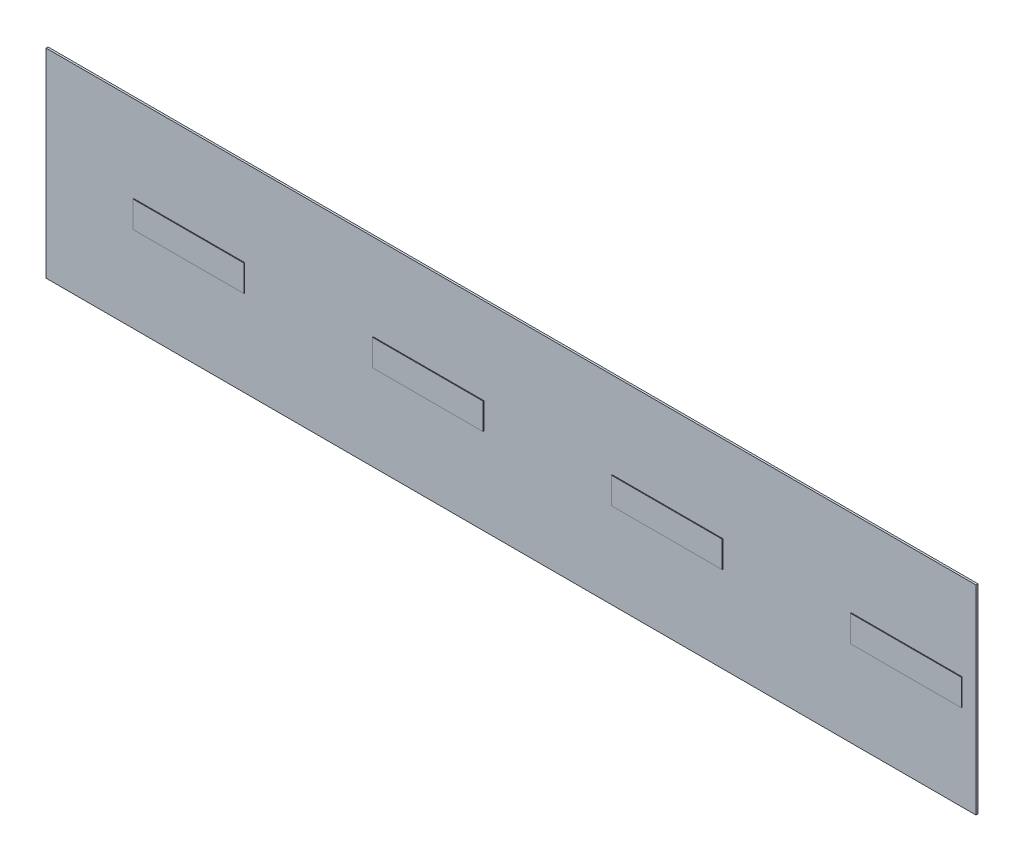
ISO-10303-21;
HEADER;
FILE_DESCRIPTION(('STEP AP214'),'2;1');
FILE_NAME('part.step','',(''),(''),'','','');
FILE_SCHEMA(('AUTOMOTIVE_DESIGN { 1 0 10303 214 1 1 1 1 }'));
ENDSEC;
DATA;
#1=APPLICATION_CONTEXT('core data for automotive mechanical design processes');
#2=APPLICATION_PROTOCOL_DEFINITION('international standard','automotive_design',2000,#1);
#3=PRODUCT_CONTEXT('',#1,'mechanical');
#4=PRODUCT('Part','Part','',(#3));
#5=PRODUCT_RELATED_PRODUCT_CATEGORY('part','',(#4));
#6=PRODUCT_DEFINITION_FORMATION('','',#4);
#7=PRODUCT_DEFINITION_CONTEXT('part definition',#1,'design');
#8=PRODUCT_DEFINITION('design','',#6,#7);
#9=PRODUCT_DEFINITION_SHAPE('','',#8);
#10=(LENGTH_UNIT() NAMED_UNIT(*) SI_UNIT(.MILLI.,.METRE.));
#11=(NAMED_UNIT(*) PLANE_ANGLE_UNIT() SI_UNIT($,.RADIAN.));
#12=(NAMED_UNIT(*) SI_UNIT($,.STERADIAN.) SOLID_ANGLE_UNIT());
#13=UNCERTAINTY_MEASURE_WITH_UNIT(LENGTH_MEASURE(1.E-05),#10,'distance_accuracy_value','');
#14=(GEOMETRIC_REPRESENTATION_CONTEXT(3) GLOBAL_UNCERTAINTY_ASSIGNED_CONTEXT((#13)) GLOBAL_UNIT_ASSIGNED_CONTEXT((#10,
#11,#12)) REPRESENTATION_CONTEXT('',''));
#15=CARTESIAN_POINT('',(0.,0.,0.));
#16=DIRECTION('',(0.,0.,1.));
#17=DIRECTION('',(1.,0.,0.));
#18=AXIS2_PLACEMENT_3D('',#15,#16,#17);
#19=CARTESIAN_POINT('',(0.,0.,1.5));
#20=DIRECTION('',(0.,0.,-1.));
#21=DIRECTION('',(-1.,0.,0.));
#22=AXIS2_PLACEMENT_3D('',#19,#20,#21);
#23=PLANE('',#22);
#24=DIRECTION('',(0.,1.,0.));
#25=VECTOR('',#24,1.);
#26=CARTESIAN_POINT('',(149.523395653635,65.0625036042411,1.5));
#27=LINE('',#26,#25);
#28=CARTESIAN_POINT('',(149.523395653635,65.0625036042411,1.5));
#29=VERTEX_POINT('',#28);
#30=CARTESIAN_POINT('',(149.523395653635,84.9374963957589,1.5));
#31=VERTEX_POINT('',#30);
#32=EDGE_CURVE('E227',#29,#31,#27,.T.);
#33=ORIENTED_EDGE('',*,*,#32,.F.);
#34=DIRECTION('',(1.,0.,0.));
#35=VECTOR('',#34,1.);
#36=CARTESIAN_POINT('',(66.1651402081605,65.0625036042411,1.5));
#37=LINE('',#36,#35);
#38=CARTESIAN_POINT('',(66.1651402081605,65.0625036042411,1.5));
#39=VERTEX_POINT('',#38);
#40=EDGE_CURVE('E217',#39,#29,#37,.T.);
#41=ORIENTED_EDGE('',*,*,#40,.F.);
#42=DIRECTION('',(0.,-1.,0.));
#43=VECTOR('',#42,1.);
#44=CARTESIAN_POINT('',(66.1651402081605,65.0625036042411,1.5));
#45=LINE('',#44,#43);
#46=CARTESIAN_POINT('',(66.1651402081605,84.9374963957589,1.5));
#47=VERTEX_POINT('',#46);
#48=EDGE_CURVE('E220',#47,#39,#45,.T.);
#49=ORIENTED_EDGE('',*,*,#48,.F.);
#50=DIRECTION('',(-1.,0.,0.));
#51=VECTOR('',#50,1.);
#52=CARTESIAN_POINT('',(66.1651402081605,84.9374963957589,1.5));
#53=LINE('',#52,#51);
#54=EDGE_CURVE('E224',#31,#47,#53,.T.);
#55=ORIENTED_EDGE('',*,*,#54,.F.);
#56=EDGE_LOOP('',(#33,#41,#49,#55));
#57=FACE_BOUND('',#56,.T.);
#58=DIRECTION('',(-1.,0.,0.));
#59=VECTOR('',#58,1.);
#60=CARTESIAN_POINT('',(246.16514020816,84.9374963957589,1.5));
#61=LINE('',#60,#59);
#62=CARTESIAN_POINT('',(329.523395653635,84.9374963957589,1.5));
#63=VERTEX_POINT('',#62);
#64=CARTESIAN_POINT('',(246.16514020816,84.9374963957589,1.5));
#65=VERTEX_POINT('',#64);
#66=EDGE_CURVE('E263',#63,#65,#61,.T.);
#67=ORIENTED_EDGE('',*,*,#66,.F.);
#68=DIRECTION('',(0.,1.,0.));
#69=VECTOR('',#68,1.);
#70=CARTESIAN_POINT('',(329.523395653635,65.0625036042411,1.5));
#71=LINE('',#70,#69);
#72=CARTESIAN_POINT('',(329.523395653635,65.0625036042411,1.5));
#73=VERTEX_POINT('',#72);
#74=EDGE_CURVE('E275',#73,#63,#71,.T.);
#75=ORIENTED_EDGE('',*,*,#74,.F.);
#76=DIRECTION('',(1.,0.,0.));
#77=VECTOR('',#76,1.);
#78=CARTESIAN_POINT('',(246.16514020816,65.0625036042411,1.5));
#79=LINE('',#78,#77);
#80=CARTESIAN_POINT('',(246.16514020816,65.0625036042411,1.5));
#81=VERTEX_POINT('',#80);
#82=EDGE_CURVE('E287',#81,#73,#79,.T.);
#83=ORIENTED_EDGE('',*,*,#82,.F.);
#84=DIRECTION('',(0.,-1.,0.));
#85=VECTOR('',#84,1.);
#86=CARTESIAN_POINT('',(246.16514020816,65.0625036042411,1.5));
#87=LINE('',#86,#85);
#88=EDGE_CURVE('E284',#65,#81,#87,.T.);
#89=ORIENTED_EDGE('',*,*,#88,.F.);
#90=EDGE_LOOP('',(#67,#75,#83,#89));
#91=FACE_BOUND('',#90,.T.);
#92=DIRECTION('',(0.,-1.,0.));
#93=VECTOR('',#92,1.);
#94=CARTESIAN_POINT('',(0.,0.,1.5));
#95=LINE('',#94,#93);
#96=CARTESIAN_POINT('',(0.,150.,1.5));
#97=VERTEX_POINT('',#96);
#98=CARTESIAN_POINT('',(0.,0.,1.5));
#99=VERTEX_POINT('',#98);
#100=EDGE_CURVE('E304',#97,#99,#95,.T.);
#101=ORIENTED_EDGE('',*,*,#100,.T.);
#102=DIRECTION('',(1.,0.,0.));
#103=VECTOR('',#102,1.);
#104=CARTESIAN_POINT('',(0.,0.,1.5));
#105=LINE('',#104,#103);
#106=CARTESIAN_POINT('',(700.,0.,1.5));
#107=VERTEX_POINT('',#106);
#108=EDGE_CURVE('E307',#99,#107,#105,.T.);
#109=ORIENTED_EDGE('',*,*,#108,.T.);
#110=DIRECTION('',(0.,1.,0.));
#111=VECTOR('',#110,1.);
#112=CARTESIAN_POINT('',(700.,0.,1.5));
#113=LINE('',#112,#111);
#114=CARTESIAN_POINT('',(700.,150.,1.5));
#115=VERTEX_POINT('',#114);
#116=EDGE_CURVE('E310',#107,#115,#113,.T.);
#117=ORIENTED_EDGE('',*,*,#116,.T.);
#118=DIRECTION('',(-1.,0.,0.));
#119=VECTOR('',#118,1.);
#120=CARTESIAN_POINT('',(0.,150.,1.5));
#121=LINE('',#120,#119);
#122=EDGE_CURVE('E312',#115,#97,#121,.T.);
#123=ORIENTED_EDGE('',*,*,#122,.T.);
#124=EDGE_LOOP('',(#101,#109,#117,#123));
#125=FACE_BOUND('',#124,.T.);
#126=DIRECTION('',(-1.,0.,0.));
#127=VECTOR('',#126,1.);
#128=CARTESIAN_POINT('',(426.16514020816,84.9374963957589,1.5));
#129=LINE('',#128,#127);
#130=CARTESIAN_POINT('',(509.523395653635,84.9374963957589,1.5));
#131=VERTEX_POINT('',#130);
#132=CARTESIAN_POINT('',(426.16514020816,84.9374963957589,1.5));
#133=VERTEX_POINT('',#132);
#134=EDGE_CURVE('E260',#131,#133,#129,.T.);
#135=ORIENTED_EDGE('',*,*,#134,.F.);
#136=DIRECTION('',(0.,1.,0.));
#137=VECTOR('',#136,1.);
#138=CARTESIAN_POINT('',(509.523395653635,65.0625036042411,1.5));
#139=LINE('',#138,#137);
#140=CARTESIAN_POINT('',(509.523395653635,65.0625036042411,1.5));
#141=VERTEX_POINT('',#140);
#142=EDGE_CURVE('E250',#141,#131,#139,.T.);
#143=ORIENTED_EDGE('',*,*,#142,.F.);
#144=DIRECTION('',(1.,0.,0.));
#145=VECTOR('',#144,1.);
#146=CARTESIAN_POINT('',(426.16514020816,65.0625036042411,1.5));
#147=LINE('',#146,#145);
#148=CARTESIAN_POINT('',(426.16514020816,65.0625036042411,1.5));
#149=VERTEX_POINT('',#148);
#150=EDGE_CURVE('E253',#149,#141,#147,.T.);
#151=ORIENTED_EDGE('',*,*,#150,.F.);
#152=DIRECTION('',(0.,-1.,0.));
#153=VECTOR('',#152,1.);
#154=CARTESIAN_POINT('',(426.16514020816,65.0625036042411,1.5));
#155=LINE('',#154,#153);
#156=EDGE_CURVE('E257',#133,#149,#155,.T.);
#157=ORIENTED_EDGE('',*,*,#156,.F.);
#158=EDGE_LOOP('',(#135,#143,#151,#157));
#159=FACE_BOUND('',#158,.T.);
#160=DIRECTION('',(-1.,0.,0.));
#161=VECTOR('',#160,1.);
#162=CARTESIAN_POINT('',(606.16514020816,84.9374963957589,1.5));
#163=LINE('',#162,#161);
#164=CARTESIAN_POINT('',(689.523395653635,84.9374963957589,1.5));
#165=VERTEX_POINT('',#164);
#166=CARTESIAN_POINT('',(606.16514020816,84.9374963957589,1.5));
#167=VERTEX_POINT('',#166);
#168=EDGE_CURVE('E170',#165,#167,#163,.T.);
#169=ORIENTED_EDGE('',*,*,#168,.F.);
#170=DIRECTION('',(0.,1.,0.));
#171=VECTOR('',#170,1.);
#172=CARTESIAN_POINT('',(689.523395653635,65.0625036042411,1.5));
#173=LINE('',#172,#171);
#174=CARTESIAN_POINT('',(689.523395653635,65.0625036042411,1.5));
#175=VERTEX_POINT('',#174);
#176=EDGE_CURVE('E172',#175,#165,#173,.T.);
#177=ORIENTED_EDGE('',*,*,#176,.F.);
#178=DIRECTION('',(1.,0.,0.));
#179=VECTOR('',#178,1.);
#180=CARTESIAN_POINT('',(606.16514020816,65.0625036042411,1.5));
#181=LINE('',#180,#179);
#182=CARTESIAN_POINT('',(606.16514020816,65.0625036042411,1.5));
#183=VERTEX_POINT('',#182);
#184=EDGE_CURVE('E57',#183,#175,#181,.T.);
#185=ORIENTED_EDGE('',*,*,#184,.F.);
#186=DIRECTION('',(0.,-1.,0.));
#187=VECTOR('',#186,1.);
#188=CARTESIAN_POINT('',(606.16514020816,65.0625036042411,1.5));
#189=LINE('',#188,#187);
#190=EDGE_CURVE('E52',#167,#183,#189,.T.);
#191=ORIENTED_EDGE('',*,*,#190,.F.);
#192=EDGE_LOOP('',(#169,#177,#185,#191));
#193=FACE_BOUND('',#192,.T.);
#194=ADVANCED_FACE('F37',(#57,#91,#125,#159,#193),#23,.F.);
#195=CARTESIAN_POINT('',(0.,0.,1.5));
#196=DIRECTION('',(1.,0.,0.));
#197=DIRECTION('',(0.,0.,-1.));
#198=AXIS2_PLACEMENT_3D('',#195,#196,#197);
#199=PLANE('',#198);
#200=DIRECTION('',(0.,-1.,0.));
#201=VECTOR('',#200,1.);
#202=CARTESIAN_POINT('',(0.,0.,0.));
#203=LINE('',#202,#201);
#204=CARTESIAN_POINT('',(0.,150.,0.));
#205=VERTEX_POINT('',#204);
#206=CARTESIAN_POINT('',(0.,0.,0.));
#207=VERTEX_POINT('',#206);
#208=EDGE_CURVE('E303',#205,#207,#203,.T.);
#209=ORIENTED_EDGE('',*,*,#208,.T.);
#210=DIRECTION('',(0.,0.,-1.));
#211=VECTOR('',#210,1.);
#212=CARTESIAN_POINT('',(0.,0.,1.5));
#213=LINE('',#212,#211);
#214=EDGE_CURVE('E11',#99,#207,#213,.T.);
#215=ORIENTED_EDGE('',*,*,#214,.F.);
#216=ORIENTED_EDGE('',*,*,#100,.F.);
#217=DIRECTION('',(0.,0.,-1.));
#218=VECTOR('',#217,1.);
#219=CARTESIAN_POINT('',(0.,150.,1.5));
#220=LINE('',#219,#218);
#221=EDGE_CURVE('E314',#97,#205,#220,.T.);
#222=ORIENTED_EDGE('',*,*,#221,.T.);
#223=EDGE_LOOP('',(#209,#215,#216,#222));
#224=FACE_BOUND('',#223,.T.);
#225=ADVANCED_FACE('F39',(#224),#199,.F.);
#226=CARTESIAN_POINT('',(0.,0.,1.5));
#227=DIRECTION('',(0.,1.,0.));
#228=DIRECTION('',(0.,0.,1.));
#229=AXIS2_PLACEMENT_3D('',#226,#227,#228);
#230=PLANE('',#229);
#231=DIRECTION('',(1.,0.,0.));
#232=VECTOR('',#231,1.);
#233=CARTESIAN_POINT('',(0.,0.,0.));
#234=LINE('',#233,#232);
#235=CARTESIAN_POINT('',(700.,0.,0.));
#236=VERTEX_POINT('',#235);
#237=EDGE_CURVE('E317',#207,#236,#234,.T.);
#238=ORIENTED_EDGE('',*,*,#237,.T.);
#239=DIRECTION('',(0.,0.,-1.));
#240=VECTOR('',#239,1.);
#241=CARTESIAN_POINT('',(700.,0.,1.5));
#242=LINE('',#241,#240);
#243=EDGE_CURVE('E45',#107,#236,#242,.T.);
#244=ORIENTED_EDGE('',*,*,#243,.F.);
#245=ORIENTED_EDGE('',*,*,#108,.F.);
#246=ORIENTED_EDGE('',*,*,#214,.T.);
#247=EDGE_LOOP('',(#238,#244,#245,#246));
#248=FACE_BOUND('',#247,.T.);
#249=ADVANCED_FACE('F347',(#248),#230,.F.);
#250=CARTESIAN_POINT('',(700.,0.,1.5));
#251=DIRECTION('',(-1.,0.,0.));
#252=DIRECTION('',(0.,0.,1.));
#253=AXIS2_PLACEMENT_3D('',#250,#251,#252);
#254=PLANE('',#253);
#255=DIRECTION('',(0.,1.,0.));
#256=VECTOR('',#255,1.);
#257=CARTESIAN_POINT('',(700.,0.,0.));
#258=LINE('',#257,#256);
#259=CARTESIAN_POINT('',(700.,150.,0.));
#260=VERTEX_POINT('',#259);
#261=EDGE_CURVE('E319',#236,#260,#258,.T.);
#262=ORIENTED_EDGE('',*,*,#261,.T.);
#263=DIRECTION('',(0.,0.,-1.));
#264=VECTOR('',#263,1.);
#265=CARTESIAN_POINT('',(700.,150.,1.5));
#266=LINE('',#265,#264);
#267=EDGE_CURVE('E324',#115,#260,#266,.T.);
#268=ORIENTED_EDGE('',*,*,#267,.F.);
#269=ORIENTED_EDGE('',*,*,#116,.F.);
#270=ORIENTED_EDGE('',*,*,#243,.T.);
#271=EDGE_LOOP('',(#262,#268,#269,#270));
#272=FACE_BOUND('',#271,.T.);
#273=ADVANCED_FACE('F331',(#272),#254,.F.);
#274=CARTESIAN_POINT('',(0.,150.,1.5));
#275=DIRECTION('',(0.,-1.,0.));
#276=DIRECTION('',(0.,0.,-1.));
#277=AXIS2_PLACEMENT_3D('',#274,#275,#276);
#278=PLANE('',#277);
#279=DIRECTION('',(-1.,0.,0.));
#280=VECTOR('',#279,1.);
#281=CARTESIAN_POINT('',(0.,150.,0.));
#282=LINE('',#281,#280);
#283=EDGE_CURVE('E308',#260,#205,#282,.T.);
#284=ORIENTED_EDGE('',*,*,#283,.T.);
#285=ORIENTED_EDGE('',*,*,#221,.F.);
#286=ORIENTED_EDGE('',*,*,#122,.F.);
#287=ORIENTED_EDGE('',*,*,#267,.T.);
#288=EDGE_LOOP('',(#284,#285,#286,#287));
#289=FACE_BOUND('',#288,.T.);
#290=ADVANCED_FACE('F340',(#289),#278,.F.);
#291=CARTESIAN_POINT('',(0.,0.,0.));
#292=DIRECTION('',(0.,0.,-1.));
#293=DIRECTION('',(-1.,0.,0.));
#294=AXIS2_PLACEMENT_3D('',#291,#292,#293);
#295=PLANE('',#294);
#296=ORIENTED_EDGE('',*,*,#208,.F.);
#297=ORIENTED_EDGE('',*,*,#283,.F.);
#298=ORIENTED_EDGE('',*,*,#261,.F.);
#299=ORIENTED_EDGE('',*,*,#237,.F.);
#300=EDGE_LOOP('',(#296,#297,#298,#299));
#301=FACE_BOUND('',#300,.T.);
#302=ADVANCED_FACE('F337',(#301),#295,.T.);
#303=CARTESIAN_POINT('',(246.16514020816,84.9374963957589,2.1));
#304=DIRECTION('',(0.,-1.,0.));
#305=DIRECTION('',(0.,0.,-1.));
#306=AXIS2_PLACEMENT_3D('',#303,#304,#305);
#307=PLANE('',#306);
#308=ORIENTED_EDGE('',*,*,#66,.T.);
#309=DIRECTION('',(0.,0.,-1.));
#310=VECTOR('',#309,1.);
#311=CARTESIAN_POINT('',(246.16514020816,84.9374963957589,2.1));
#312=LINE('',#311,#310);
#313=CARTESIAN_POINT('',(246.16514020816,84.9374963957589,2.1));
#314=VERTEX_POINT('',#313);
#315=EDGE_CURVE('E300',#314,#65,#312,.T.);
#316=ORIENTED_EDGE('',*,*,#315,.F.);
#317=DIRECTION('',(-1.,0.,0.));
#318=VECTOR('',#317,1.);
#319=CARTESIAN_POINT('',(246.16514020816,84.9374963957589,2.1));
#320=LINE('',#319,#318);
#321=CARTESIAN_POINT('',(329.523395653635,84.9374963957589,2.1));
#322=VERTEX_POINT('',#321);
#323=EDGE_CURVE('E271',#322,#314,#320,.T.);
#324=ORIENTED_EDGE('',*,*,#323,.F.);
#325=DIRECTION('',(0.,0.,-1.));
#326=VECTOR('',#325,1.);
#327=CARTESIAN_POINT('',(329.523395653635,84.9374963957589,2.1));
#328=LINE('',#327,#326);
#329=EDGE_CURVE('E281',#322,#63,#328,.T.);
#330=ORIENTED_EDGE('',*,*,#329,.T.);
#331=EDGE_LOOP('',(#308,#316,#324,#330));
#332=FACE_BOUND('',#331,.T.);
#333=ADVANCED_FACE('F362',(#332),#307,.F.);
#334=CARTESIAN_POINT('',(246.16514020816,65.0625036042411,2.1));
#335=DIRECTION('',(1.,0.,0.));
#336=DIRECTION('',(0.,0.,-1.));
#337=AXIS2_PLACEMENT_3D('',#334,#335,#336);
#338=PLANE('',#337);
#339=ORIENTED_EDGE('',*,*,#88,.T.);
#340=DIRECTION('',(0.,0.,-1.));
#341=VECTOR('',#340,1.);
#342=CARTESIAN_POINT('',(246.16514020816,65.0625036042411,2.1));
#343=LINE('',#342,#341);
#344=CARTESIAN_POINT('',(246.16514020816,65.0625036042411,2.1));
#345=VERTEX_POINT('',#344);
#346=EDGE_CURVE('E297',#345,#81,#343,.T.);
#347=ORIENTED_EDGE('',*,*,#346,.F.);
#348=DIRECTION('',(0.,-1.,0.));
#349=VECTOR('',#348,1.);
#350=CARTESIAN_POINT('',(246.16514020816,65.0625036042411,2.1));
#351=LINE('',#350,#349);
#352=EDGE_CURVE('E274',#314,#345,#351,.T.);
#353=ORIENTED_EDGE('',*,*,#352,.F.);
#354=ORIENTED_EDGE('',*,*,#315,.T.);
#355=EDGE_LOOP('',(#339,#347,#353,#354));
#356=FACE_BOUND('',#355,.T.);
#357=ADVANCED_FACE('F381',(#356),#338,.F.);
#358=CARTESIAN_POINT('',(246.16514020816,65.0625036042411,2.1));
#359=DIRECTION('',(0.,1.,0.));
#360=DIRECTION('',(0.,0.,1.));
#361=AXIS2_PLACEMENT_3D('',#358,#359,#360);
#362=PLANE('',#361);
#363=ORIENTED_EDGE('',*,*,#82,.T.);
#364=DIRECTION('',(0.,0.,-1.));
#365=VECTOR('',#364,1.);
#366=CARTESIAN_POINT('',(329.523395653635,65.0625036042411,2.1));
#367=LINE('',#366,#365);
#368=CARTESIAN_POINT('',(329.523395653635,65.0625036042411,2.1));
#369=VERTEX_POINT('',#368);
#370=EDGE_CURVE('E294',#369,#73,#367,.T.);
#371=ORIENTED_EDGE('',*,*,#370,.F.);
#372=DIRECTION('',(1.,0.,0.));
#373=VECTOR('',#372,1.);
#374=CARTESIAN_POINT('',(246.16514020816,65.0625036042411,2.1));
#375=LINE('',#374,#373);
#376=EDGE_CURVE('E277',#345,#369,#375,.T.);
#377=ORIENTED_EDGE('',*,*,#376,.F.);
#378=ORIENTED_EDGE('',*,*,#346,.T.);
#379=EDGE_LOOP('',(#363,#371,#377,#378));
#380=FACE_BOUND('',#379,.T.);
#381=ADVANCED_FACE('F388',(#380),#362,.F.);
#382=CARTESIAN_POINT('',(329.523395653635,65.0625036042411,2.1));
#383=DIRECTION('',(-1.,0.,0.));
#384=DIRECTION('',(0.,0.,1.));
#385=AXIS2_PLACEMENT_3D('',#382,#383,#384);
#386=PLANE('',#385);
#387=ORIENTED_EDGE('',*,*,#74,.T.);
#388=ORIENTED_EDGE('',*,*,#329,.F.);
#389=DIRECTION('',(0.,1.,0.));
#390=VECTOR('',#389,1.);
#391=CARTESIAN_POINT('',(329.523395653635,65.0625036042411,2.1));
#392=LINE('',#391,#390);
#393=EDGE_CURVE('E279',#369,#322,#392,.T.);
#394=ORIENTED_EDGE('',*,*,#393,.F.);
#395=ORIENTED_EDGE('',*,*,#370,.T.);
#396=EDGE_LOOP('',(#387,#388,#394,#395));
#397=FACE_BOUND('',#396,.T.);
#398=ADVANCED_FACE('F395',(#397),#386,.F.);
#399=CARTESIAN_POINT('',(0.,0.,2.1));
#400=DIRECTION('',(0.,0.,1.));
#401=DIRECTION('',(1.,0.,0.));
#402=AXIS2_PLACEMENT_3D('',#399,#400,#401);
#403=PLANE('',#402);
#404=ORIENTED_EDGE('',*,*,#323,.T.);
#405=ORIENTED_EDGE('',*,*,#352,.T.);
#406=ORIENTED_EDGE('',*,*,#376,.T.);
#407=ORIENTED_EDGE('',*,*,#393,.T.);
#408=EDGE_LOOP('',(#404,#405,#406,#407));
#409=FACE_BOUND('',#408,.T.);
#410=ADVANCED_FACE('F403',(#409),#403,.T.);
#411=CARTESIAN_POINT('',(426.16514020816,84.9374963957589,2.1));
#412=DIRECTION('',(0.,-1.,0.));
#413=DIRECTION('',(0.,0.,-1.));
#414=AXIS2_PLACEMENT_3D('',#411,#412,#413);
#415=PLANE('',#414);
#416=ORIENTED_EDGE('',*,*,#134,.T.);
#417=DIRECTION('',(0.,0.,-1.));
#418=VECTOR('',#417,1.);
#419=CARTESIAN_POINT('',(426.16514020816,84.9374963957589,2.1));
#420=LINE('',#419,#418);
#421=CARTESIAN_POINT('',(426.16514020816,84.9374963957589,2.1));
#422=VERTEX_POINT('',#421);
#423=EDGE_CURVE('E230',#422,#133,#420,.T.);
#424=ORIENTED_EDGE('',*,*,#423,.F.);
#425=DIRECTION('',(-1.,0.,0.));
#426=VECTOR('',#425,1.);
#427=CARTESIAN_POINT('',(426.16514020816,84.9374963957589,2.1));
#428=LINE('',#427,#426);
#429=CARTESIAN_POINT('',(509.523395653635,84.9374963957589,2.1));
#430=VERTEX_POINT('',#429);
#431=EDGE_CURVE('E254',#430,#422,#428,.T.);
#432=ORIENTED_EDGE('',*,*,#431,.F.);
#433=DIRECTION('',(0.,0.,-1.));
#434=VECTOR('',#433,1.);
#435=CARTESIAN_POINT('',(509.523395653635,84.9374963957589,2.1));
#436=LINE('',#435,#434);
#437=EDGE_CURVE('E246',#430,#131,#436,.T.);
#438=ORIENTED_EDGE('',*,*,#437,.T.);
#439=EDGE_LOOP('',(#416,#424,#432,#438));
#440=FACE_BOUND('',#439,.T.);
#441=ADVANCED_FACE('F411',(#440),#415,.F.);
#442=CARTESIAN_POINT('',(426.16514020816,65.0625036042411,2.1));
#443=DIRECTION('',(1.,0.,0.));
#444=DIRECTION('',(0.,0.,-1.));
#445=AXIS2_PLACEMENT_3D('',#442,#443,#444);
#446=PLANE('',#445);
#447=ORIENTED_EDGE('',*,*,#156,.T.);
#448=DIRECTION('',(0.,0.,-1.));
#449=VECTOR('',#448,1.);
#450=CARTESIAN_POINT('',(426.16514020816,65.0625036042411,2.1));
#451=LINE('',#450,#449);
#452=CARTESIAN_POINT('',(426.16514020816,65.0625036042411,2.1));
#453=VERTEX_POINT('',#452);
#454=EDGE_CURVE('E240',#453,#149,#451,.T.);
#455=ORIENTED_EDGE('',*,*,#454,.F.);
#456=DIRECTION('',(0.,-1.,0.));
#457=VECTOR('',#456,1.);
#458=CARTESIAN_POINT('',(426.16514020816,65.0625036042411,2.1));
#459=LINE('',#458,#457);
#460=EDGE_CURVE('E267',#422,#453,#459,.T.);
#461=ORIENTED_EDGE('',*,*,#460,.F.);
#462=ORIENTED_EDGE('',*,*,#423,.T.);
#463=EDGE_LOOP('',(#447,#455,#461,#462));
#464=FACE_BOUND('',#463,.T.);
#465=ADVANCED_FACE('F419',(#464),#446,.F.);
#466=CARTESIAN_POINT('',(426.16514020816,65.0625036042411,2.1));
#467=DIRECTION('',(0.,1.,0.));
#468=DIRECTION('',(0.,0.,1.));
#469=AXIS2_PLACEMENT_3D('',#466,#467,#468);
#470=PLANE('',#469);
#471=ORIENTED_EDGE('',*,*,#150,.T.);
#472=DIRECTION('',(0.,0.,-1.));
#473=VECTOR('',#472,1.);
#474=CARTESIAN_POINT('',(509.523395653635,65.0625036042411,2.1));
#475=LINE('',#474,#473);
#476=CARTESIAN_POINT('',(509.523395653635,65.0625036042411,2.1));
#477=VERTEX_POINT('',#476);
#478=EDGE_CURVE('E243',#477,#141,#475,.T.);
#479=ORIENTED_EDGE('',*,*,#478,.F.);
#480=DIRECTION('',(1.,0.,0.));
#481=VECTOR('',#480,1.);
#482=CARTESIAN_POINT('',(426.16514020816,65.0625036042411,2.1));
#483=LINE('',#482,#481);
#484=EDGE_CURVE('E265',#453,#477,#483,.T.);
#485=ORIENTED_EDGE('',*,*,#484,.F.);
#486=ORIENTED_EDGE('',*,*,#454,.T.);
#487=EDGE_LOOP('',(#471,#479,#485,#486));
#488=FACE_BOUND('',#487,.T.);
#489=ADVANCED_FACE('F427',(#488),#470,.F.);
#490=CARTESIAN_POINT('',(509.523395653635,65.0625036042411,2.1));
#491=DIRECTION('',(-1.,0.,0.));
#492=DIRECTION('',(0.,0.,1.));
#493=AXIS2_PLACEMENT_3D('',#490,#491,#492);
#494=PLANE('',#493);
#495=ORIENTED_EDGE('',*,*,#142,.T.);
#496=ORIENTED_EDGE('',*,*,#437,.F.);
#497=DIRECTION('',(0.,1.,0.));
#498=VECTOR('',#497,1.);
#499=CARTESIAN_POINT('',(509.523395653635,65.0625036042411,2.1));
#500=LINE('',#499,#498);
#501=EDGE_CURVE('E249',#477,#430,#500,.T.);
#502=ORIENTED_EDGE('',*,*,#501,.F.);
#503=ORIENTED_EDGE('',*,*,#478,.T.);
#504=EDGE_LOOP('',(#495,#496,#502,#503));
#505=FACE_BOUND('',#504,.T.);
#506=ADVANCED_FACE('F435',(#505),#494,.F.);
#507=CARTESIAN_POINT('',(0.,0.,2.1));
#508=DIRECTION('',(0.,0.,1.));
#509=DIRECTION('',(1.,0.,0.));
#510=AXIS2_PLACEMENT_3D('',#507,#508,#509);
#511=PLANE('',#510);
#512=ORIENTED_EDGE('',*,*,#431,.T.);
#513=ORIENTED_EDGE('',*,*,#460,.T.);
#514=ORIENTED_EDGE('',*,*,#484,.T.);
#515=ORIENTED_EDGE('',*,*,#501,.T.);
#516=EDGE_LOOP('',(#512,#513,#514,#515));
#517=FACE_BOUND('',#516,.T.);
#518=ADVANCED_FACE('F443',(#517),#511,.T.);
#519=CARTESIAN_POINT('',(149.523395653635,65.0625036042411,2.1));
#520=DIRECTION('',(-1.,0.,0.));
#521=DIRECTION('',(0.,0.,1.));
#522=AXIS2_PLACEMENT_3D('',#519,#520,#521);
#523=PLANE('',#522);
#524=ORIENTED_EDGE('',*,*,#32,.T.);
#525=DIRECTION('',(0.,0.,-1.));
#526=VECTOR('',#525,1.);
#527=CARTESIAN_POINT('',(149.523395653635,84.9374963957589,2.1));
#528=LINE('',#527,#526);
#529=CARTESIAN_POINT('',(149.523395653635,84.9374963957589,2.1));
#530=VERTEX_POINT('',#529);
#531=EDGE_CURVE('E176',#530,#31,#528,.T.);
#532=ORIENTED_EDGE('',*,*,#531,.F.);
#533=DIRECTION('',(0.,1.,0.));
#534=VECTOR('',#533,1.);
#535=CARTESIAN_POINT('',(149.523395653635,65.0625036042411,2.1));
#536=LINE('',#535,#534);
#537=CARTESIAN_POINT('',(149.523395653635,65.0625036042411,2.1));
#538=VERTEX_POINT('',#537);
#539=EDGE_CURVE('E221',#538,#530,#536,.T.);
#540=ORIENTED_EDGE('',*,*,#539,.F.);
#541=DIRECTION('',(0.,0.,-1.));
#542=VECTOR('',#541,1.);
#543=CARTESIAN_POINT('',(149.523395653635,65.0625036042411,2.1));
#544=LINE('',#543,#542);
#545=EDGE_CURVE('E213',#538,#29,#544,.T.);
#546=ORIENTED_EDGE('',*,*,#545,.T.);
#547=EDGE_LOOP('',(#524,#532,#540,#546));
#548=FACE_BOUND('',#547,.T.);
#549=ADVANCED_FACE('F451',(#548),#523,.F.);
#550=CARTESIAN_POINT('',(66.1651402081605,84.9374963957589,2.1));
#551=DIRECTION('',(0.,-1.,0.));
#552=DIRECTION('',(0.,0.,-1.));
#553=AXIS2_PLACEMENT_3D('',#550,#551,#552);
#554=PLANE('',#553);
#555=ORIENTED_EDGE('',*,*,#54,.T.);
#556=DIRECTION('',(0.,0.,-1.));
#557=VECTOR('',#556,1.);
#558=CARTESIAN_POINT('',(66.1651402081605,84.9374963957589,2.1));
#559=LINE('',#558,#557);
#560=CARTESIAN_POINT('',(66.1651402081605,84.9374963957589,2.1));
#561=VERTEX_POINT('',#560);
#562=EDGE_CURVE('E207',#561,#47,#559,.T.);
#563=ORIENTED_EDGE('',*,*,#562,.F.);
#564=DIRECTION('',(-1.,0.,0.));
#565=VECTOR('',#564,1.);
#566=CARTESIAN_POINT('',(66.1651402081605,84.9374963957589,2.1));
#567=LINE('',#566,#565);
#568=EDGE_CURVE('E234',#530,#561,#567,.T.);
#569=ORIENTED_EDGE('',*,*,#568,.F.);
#570=ORIENTED_EDGE('',*,*,#531,.T.);
#571=EDGE_LOOP('',(#555,#563,#569,#570));
#572=FACE_BOUND('',#571,.T.);
#573=ADVANCED_FACE('F459',(#572),#554,.F.);
#574=CARTESIAN_POINT('',(66.1651402081605,65.0625036042411,2.1));
#575=DIRECTION('',(1.,0.,0.));
#576=DIRECTION('',(0.,0.,-1.));
#577=AXIS2_PLACEMENT_3D('',#574,#575,#576);
#578=PLANE('',#577);
#579=ORIENTED_EDGE('',*,*,#48,.T.);
#580=DIRECTION('',(0.,0.,-1.));
#581=VECTOR('',#580,1.);
#582=CARTESIAN_POINT('',(66.1651402081605,65.0625036042411,2.1));
#583=LINE('',#582,#581);
#584=CARTESIAN_POINT('',(66.1651402081605,65.0625036042411,2.1));
#585=VERTEX_POINT('',#584);
#586=EDGE_CURVE('E210',#585,#39,#583,.T.);
#587=ORIENTED_EDGE('',*,*,#586,.F.);
#588=DIRECTION('',(0.,-1.,0.));
#589=VECTOR('',#588,1.);
#590=CARTESIAN_POINT('',(66.1651402081605,65.0625036042411,2.1));
#591=LINE('',#590,#589);
#592=EDGE_CURVE('E232',#561,#585,#591,.T.);
#593=ORIENTED_EDGE('',*,*,#592,.F.);
#594=ORIENTED_EDGE('',*,*,#562,.T.);
#595=EDGE_LOOP('',(#579,#587,#593,#594));
#596=FACE_BOUND('',#595,.T.);
#597=ADVANCED_FACE('F467',(#596),#578,.F.);
#598=CARTESIAN_POINT('',(66.1651402081605,65.0625036042411,2.1));
#599=DIRECTION('',(0.,1.,0.));
#600=DIRECTION('',(0.,0.,1.));
#601=AXIS2_PLACEMENT_3D('',#598,#599,#600);
#602=PLANE('',#601);
#603=ORIENTED_EDGE('',*,*,#40,.T.);
#604=ORIENTED_EDGE('',*,*,#545,.F.);
#605=DIRECTION('',(1.,0.,0.));
#606=VECTOR('',#605,1.);
#607=CARTESIAN_POINT('',(66.1651402081605,65.0625036042411,2.1));
#608=LINE('',#607,#606);
#609=EDGE_CURVE('E216',#585,#538,#608,.T.);
#610=ORIENTED_EDGE('',*,*,#609,.F.);
#611=ORIENTED_EDGE('',*,*,#586,.T.);
#612=EDGE_LOOP('',(#603,#604,#610,#611));
#613=FACE_BOUND('',#612,.T.);
#614=ADVANCED_FACE('F475',(#613),#602,.F.);
#615=CARTESIAN_POINT('',(0.,0.,2.1));
#616=DIRECTION('',(0.,0.,-1.));
#617=DIRECTION('',(-1.,0.,0.));
#618=AXIS2_PLACEMENT_3D('',#615,#616,#617);
#619=PLANE('',#618);
#620=ORIENTED_EDGE('',*,*,#539,.T.);
#621=ORIENTED_EDGE('',*,*,#568,.T.);
#622=ORIENTED_EDGE('',*,*,#592,.T.);
#623=ORIENTED_EDGE('',*,*,#609,.T.);
#624=EDGE_LOOP('',(#620,#621,#622,#623));
#625=FACE_BOUND('',#624,.T.);
#626=ADVANCED_FACE('F483',(#625),#619,.F.);
#627=CARTESIAN_POINT('',(606.16514020816,84.9374963957589,2.1));
#628=DIRECTION('',(0.,-1.,0.));
#629=DIRECTION('',(0.,0.,-1.));
#630=AXIS2_PLACEMENT_3D('',#627,#628,#629);
#631=PLANE('',#630);
#632=ORIENTED_EDGE('',*,*,#168,.T.);
#633=DIRECTION('',(0.,0.,-1.));
#634=VECTOR('',#633,1.);
#635=CARTESIAN_POINT('',(606.16514020816,84.9374963957589,2.1));
#636=LINE('',#635,#634);
#637=CARTESIAN_POINT('',(606.16514020816,84.9374963957589,2.1));
#638=VERTEX_POINT('',#637);
#639=EDGE_CURVE('E645',#638,#167,#636,.T.);
#640=ORIENTED_EDGE('',*,*,#639,.F.);
#641=DIRECTION('',(-1.,0.,0.));
#642=VECTOR('',#641,1.);
#643=CARTESIAN_POINT('',(606.16514020816,84.9374963957589,2.1));
#644=LINE('',#643,#642);
#645=CARTESIAN_POINT('',(689.523395653635,84.9374963957589,2.1));
#646=VERTEX_POINT('',#645);
#647=EDGE_CURVE('E187',#646,#638,#644,.T.);
#648=ORIENTED_EDGE('',*,*,#647,.F.);
#649=DIRECTION('',(0.,0.,-1.));
#650=VECTOR('',#649,1.);
#651=CARTESIAN_POINT('',(689.523395653635,84.9374963957589,2.1));
#652=LINE('',#651,#650);
#653=EDGE_CURVE('E183',#646,#165,#652,.T.);
#654=ORIENTED_EDGE('',*,*,#653,.T.);
#655=EDGE_LOOP('',(#632,#640,#648,#654));
#656=FACE_BOUND('',#655,.T.);
#657=ADVANCED_FACE('F189',(#656),#631,.F.);
#658=CARTESIAN_POINT('',(606.16514020816,65.0625036042411,2.1));
#659=DIRECTION('',(1.,0.,0.));
#660=DIRECTION('',(0.,0.,-1.));
#661=AXIS2_PLACEMENT_3D('',#658,#659,#660);
#662=PLANE('',#661);
#663=ORIENTED_EDGE('',*,*,#190,.T.);
#664=DIRECTION('',(0.,0.,-1.));
#665=VECTOR('',#664,1.);
#666=CARTESIAN_POINT('',(606.16514020816,65.0625036042411,2.1));
#667=LINE('',#666,#665);
#668=CARTESIAN_POINT('',(606.16514020816,65.0625036042411,2.1));
#669=VERTEX_POINT('',#668);
#670=EDGE_CURVE('E195',#669,#183,#667,.T.);
#671=ORIENTED_EDGE('',*,*,#670,.F.);
#672=DIRECTION('',(0.,-1.,0.));
#673=VECTOR('',#672,1.);
#674=CARTESIAN_POINT('',(606.16514020816,65.0625036042411,2.1));
#675=LINE('',#674,#673);
#676=EDGE_CURVE('E202',#638,#669,#675,.T.);
#677=ORIENTED_EDGE('',*,*,#676,.F.);
#678=ORIENTED_EDGE('',*,*,#639,.T.);
#679=EDGE_LOOP('',(#663,#671,#677,#678));
#680=FACE_BOUND('',#679,.T.);
#681=ADVANCED_FACE('F498',(#680),#662,.F.);
#682=CARTESIAN_POINT('',(606.16514020816,65.0625036042411,2.1));
#683=DIRECTION('',(0.,1.,0.));
#684=DIRECTION('',(0.,0.,1.));
#685=AXIS2_PLACEMENT_3D('',#682,#683,#684);
#686=PLANE('',#685);
#687=ORIENTED_EDGE('',*,*,#184,.T.);
#688=DIRECTION('',(0.,0.,-1.));
#689=VECTOR('',#688,1.);
#690=CARTESIAN_POINT('',(689.523395653635,65.0625036042411,2.1));
#691=LINE('',#690,#689);
#692=CARTESIAN_POINT('',(689.523395653635,65.0625036042411,2.1));
#693=VERTEX_POINT('',#692);
#694=EDGE_CURVE('E186',#693,#175,#691,.T.);
#695=ORIENTED_EDGE('',*,*,#694,.F.);
#696=DIRECTION('',(1.,0.,0.));
#697=VECTOR('',#696,1.);
#698=CARTESIAN_POINT('',(606.16514020816,65.0625036042411,2.1));
#699=LINE('',#698,#697);
#700=EDGE_CURVE('E193',#669,#693,#699,.T.);
#701=ORIENTED_EDGE('',*,*,#700,.F.);
#702=ORIENTED_EDGE('',*,*,#670,.T.);
#703=EDGE_LOOP('',(#687,#695,#701,#702));
#704=FACE_BOUND('',#703,.T.);
#705=ADVANCED_FACE('F505',(#704),#686,.F.);
#706=CARTESIAN_POINT('',(689.523395653635,65.0625036042411,2.1));
#707=DIRECTION('',(-1.,0.,0.));
#708=DIRECTION('',(0.,0.,1.));
#709=AXIS2_PLACEMENT_3D('',#706,#707,#708);
#710=PLANE('',#709);
#711=ORIENTED_EDGE('',*,*,#176,.T.);
#712=ORIENTED_EDGE('',*,*,#653,.F.);
#713=DIRECTION('',(0.,1.,0.));
#714=VECTOR('',#713,1.);
#715=CARTESIAN_POINT('',(689.523395653635,65.0625036042411,2.1));
#716=LINE('',#715,#714);
#717=EDGE_CURVE('E191',#693,#646,#716,.T.);
#718=ORIENTED_EDGE('',*,*,#717,.F.);
#719=ORIENTED_EDGE('',*,*,#694,.T.);
#720=EDGE_LOOP('',(#711,#712,#718,#719));
#721=FACE_BOUND('',#720,.T.);
#722=ADVANCED_FACE('F181',(#721),#710,.F.);
#723=CARTESIAN_POINT('',(0.,0.,2.1));
#724=DIRECTION('',(0.,0.,1.));
#725=DIRECTION('',(1.,0.,0.));
#726=AXIS2_PLACEMENT_3D('',#723,#724,#725);
#727=PLANE('',#726);
#728=ORIENTED_EDGE('',*,*,#647,.T.);
#729=ORIENTED_EDGE('',*,*,#676,.T.);
#730=ORIENTED_EDGE('',*,*,#700,.T.);
#731=ORIENTED_EDGE('',*,*,#717,.T.);
#732=EDGE_LOOP('',(#728,#729,#730,#731));
#733=FACE_BOUND('',#732,.T.);
#734=ADVANCED_FACE('F520',(#733),#727,.T.);
#735=CLOSED_SHELL('',(#194,#225,#249,#273,#290,#302,#333,#357,#381,#398,#410,#441,#465,#489,
#506,#518,#549,#573,#597,#614,#626,#657,#681,#705,#722,#734));
#736=MANIFOLD_SOLID_BREP('B2',#735);
#737=ADVANCED_BREP_SHAPE_REPRESENTATION('',(#18,#736),#14);
#738=SHAPE_DEFINITION_REPRESENTATION(#9,#737);
ENDSEC;
END-ISO-10303-21;
